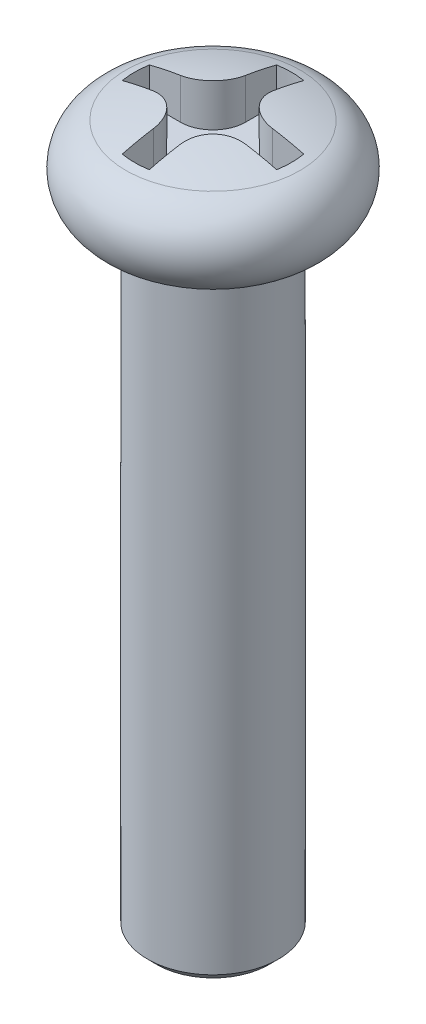
ISO-10303-21;
HEADER;
FILE_DESCRIPTION(('STEP AP214'),'2;1');
FILE_NAME('part.step','',(''),(''),'','','');
FILE_SCHEMA(('AUTOMOTIVE_DESIGN { 1 0 10303 214 1 1 1 1 }'));
ENDSEC;
DATA;
#1=APPLICATION_CONTEXT('core data for automotive mechanical design processes');
#2=APPLICATION_PROTOCOL_DEFINITION('international standard','automotive_design',2000,#1);
#3=PRODUCT_CONTEXT('',#1,'mechanical');
#4=PRODUCT('Part','Part','',(#3));
#5=PRODUCT_RELATED_PRODUCT_CATEGORY('part','',(#4));
#6=PRODUCT_DEFINITION_FORMATION('','',#4);
#7=PRODUCT_DEFINITION_CONTEXT('part definition',#1,'design');
#8=PRODUCT_DEFINITION('design','',#6,#7);
#9=PRODUCT_DEFINITION_SHAPE('','',#8);
#10=(LENGTH_UNIT() NAMED_UNIT(*) SI_UNIT(.MILLI.,.METRE.));
#11=(NAMED_UNIT(*) PLANE_ANGLE_UNIT() SI_UNIT($,.RADIAN.));
#12=(NAMED_UNIT(*) SI_UNIT($,.STERADIAN.) SOLID_ANGLE_UNIT());
#13=UNCERTAINTY_MEASURE_WITH_UNIT(LENGTH_MEASURE(1.E-05),#10,'distance_accuracy_value','');
#14=(GEOMETRIC_REPRESENTATION_CONTEXT(3) GLOBAL_UNCERTAINTY_ASSIGNED_CONTEXT((#13)) GLOBAL_UNIT_ASSIGNED_CONTEXT((#10,
#11,#12)) REPRESENTATION_CONTEXT('',''));
#15=CARTESIAN_POINT('',(0.,0.,0.));
#16=DIRECTION('',(0.,0.,1.));
#17=DIRECTION('',(1.,0.,0.));
#18=AXIS2_PLACEMENT_3D('',#15,#16,#17);
#19=CARTESIAN_POINT('',(0.8838834764832,0.85,-0.8838834764832));
#20=DIRECTION('',(0.,1.,0.));
#21=DIRECTION('',(1.,0.,0.));
#22=AXIS2_PLACEMENT_3D('',#19,#20,#21);
#23=CYLINDRICAL_SURFACE('',#22,0.625);
#24=DIRECTION('',(0.,1.,0.));
#25=VECTOR('',#24,1.);
#26=CARTESIAN_POINT('',(0.2588834764932,0.85000000001,-0.8838834764932));
#27=LINE('',#26,#25);
#28=CARTESIAN_POINT('',(0.2588834764832,0.85,-0.8838834764832));
#29=VERTEX_POINT('',#28);
#30=CARTESIAN_POINT('',(0.2588834764832,1.625758041496,-0.8838834764832));
#31=VERTEX_POINT('',#30);
#32=EDGE_CURVE('E39',#29,#31,#27,.T.);
#33=ORIENTED_EDGE('',*,*,#32,.F.);
#34=CARTESIAN_POINT('',(0.8838834764932,0.85000000001,-0.8838834764932));
#35=DIRECTION('',(0.,1.,0.));
#36=DIRECTION('',(-1.,0.,0.));
#37=AXIS2_PLACEMENT_3D('',#34,#35,#36);
#38=CIRCLE('',#37,0.625);
#39=CARTESIAN_POINT('',(0.8838834764832,0.85,-0.2588834764832));
#40=VERTEX_POINT('',#39);
#41=EDGE_CURVE('E11',#29,#40,#38,.T.);
#42=ORIENTED_EDGE('',*,*,#41,.T.);
#43=DIRECTION('',(0.,1.,0.));
#44=VECTOR('',#43,1.);
#45=CARTESIAN_POINT('',(0.8838834764932,0.85000000001,-0.2588834764932));
#46=LINE('',#45,#44);
#47=CARTESIAN_POINT('',(0.8838834764832,1.625758041496,-0.2588834764832));
#48=VERTEX_POINT('',#47);
#49=EDGE_CURVE('E28',#40,#48,#46,.T.);
#50=ORIENTED_EDGE('',*,*,#49,.T.);
#51=CARTESIAN_POINT('',(0.2588834764932,1.625758041506,-0.8838834764932));
#52=CARTESIAN_POINT('',(0.2588834764932,1.627313817163,-0.8738932386037));
#53=CARTESIAN_POINT('',(0.2593614768653,1.63034839356,-0.8539208494841));
#54=CARTESIAN_POINT('',(0.2615225676338,1.634673278244,-0.8239545492494));
#55=CARTESIAN_POINT('',(0.2650935390921,1.63872019528,-0.7943462278779));
#56=CARTESIAN_POINT('',(0.2700536841239,1.642515148454,-0.7649531756351));
#57=CARTESIAN_POINT('',(0.2767499563393,1.646228723206,-0.7343323588506));
#58=CARTESIAN_POINT('',(0.2857599781692,1.649942886485,-0.7013784870498));
#59=CARTESIAN_POINT('',(0.2980319218556,1.65369658224,-0.6648919217842));
#60=CARTESIAN_POINT('',(0.3145124725157,1.657361744586,-0.6247522681375));
#61=CARTESIAN_POINT('',(0.3364639007554,1.660768644949,-0.5807949332556));
#62=CARTESIAN_POINT('',(0.3650765799814,1.663614857499,-0.5337874817505));
#63=CARTESIAN_POINT('',(0.4006323004999,1.665513948944,-0.4859527733813));
#64=CARTESIAN_POINT('',(0.4430484395472,1.666174855786,-0.4392623764243));
#65=CARTESIAN_POINT('',(0.4925759173538,1.66536575229,-0.3949675528772));
#66=CARTESIAN_POINT('',(0.5489382072169,1.662886586189,-0.3546342400591));
#67=CARTESIAN_POINT('',(0.6115583802521,1.658585384304,-0.3198068479943));
#68=CARTESIAN_POINT('',(0.6775697978204,1.652591342923,-0.2924914538816));
#69=CARTESIAN_POINT('',(0.7456724189569,1.645052014393,-0.2730026794436));
#70=CARTESIAN_POINT('',(0.8147416661566,1.636123692416,-0.2614199025382));
#71=CARTESIAN_POINT('',(0.8609123051746,1.629335332612,-0.2588834764932));
#72=CARTESIAN_POINT('',(0.8838834764932,1.625758041506,-0.2588834764932));
#73=B_SPLINE_CURVE_WITH_KNOTS('',3,(#51,#52,#53,#54,#55,#56,#57,#58,#59,#60,#61,#62,#63,#64,#65,
#66,#67,#68,#69,#70,#71,#72),.UNSPECIFIED.,.F.,.F.,(4,1,1,1,1,1,1,1,1,1,1,1,1,1,1,1,1,1,1,4),
(0.,0.05263157894737,0.1052631578947,0.1578947368421,0.2105263157895,0.2631578947368,
0.3157894736842,0.3684210526316,0.4210526315789,0.4736842105263,0.5263157894737,0.5789473684211,
0.6315789473684,0.6842105263158,0.7368421052632,0.7894736842105,0.8421052631579,0.8947368421053,
0.9473684210526,1.),.UNSPECIFIED.);
#74=EDGE_CURVE('E195',#31,#48,#73,.T.);
#75=ORIENTED_EDGE('',*,*,#74,.F.);
#76=EDGE_LOOP('',(#33,#42,#50,#75));
#77=FACE_BOUND('',#76,.T.);
#78=ADVANCED_FACE('F17',(#77),#23,.T.);
#79=CARTESIAN_POINT('',(0.8838834764832,0.85,-0.2588834764832));
#80=DIRECTION('',(0.,0.,-1.));
#81=DIRECTION('',(0.,-1.,0.));
#82=AXIS2_PLACEMENT_3D('',#79,#80,#81);
#83=PLANE('',#82);
#84=ORIENTED_EDGE('',*,*,#49,.F.);
#85=DIRECTION('',(1.,0.,0.));
#86=VECTOR('',#85,1.);
#87=CARTESIAN_POINT('',(0.8838834764932,0.85000000001,-0.2588834764932));
#88=LINE('',#87,#86);
#89=CARTESIAN_POINT('',(1.477490895269,0.85,-0.2588834764832));
#90=VERTEX_POINT('',#89);
#91=EDGE_CURVE('E201',#40,#90,#88,.T.);
#92=ORIENTED_EDGE('',*,*,#91,.T.);
#93=DIRECTION('',(0.,1.,0.));
#94=VECTOR('',#93,1.);
#95=CARTESIAN_POINT('',(1.477490895279,0.85000000001,-0.2588834764932));
#96=LINE('',#95,#94);
#97=CARTESIAN_POINT('',(1.477490895269,1.500900827794,-0.2588834764832));
#98=VERTEX_POINT('',#97);
#99=EDGE_CURVE('E205',#90,#98,#96,.T.);
#100=ORIENTED_EDGE('',*,*,#99,.T.);
#101=CARTESIAN_POINT('',(0.,-4.05000000001,-0.2588834764932));
#102=DIRECTION('',(0.,0.,-1.));
#103=DIRECTION('',(0.153874903711735,0.988090336967073,0.));
#104=AXIS2_PLACEMENT_3D('',#101,#102,#103);
#105=CIRCLE('',#104,5.7441692);
#106=EDGE_CURVE('E285',#48,#98,#105,.T.);
#107=ORIENTED_EDGE('',*,*,#106,.F.);
#108=EDGE_LOOP('',(#84,#92,#100,#107));
#109=FACE_BOUND('',#108,.T.);
#110=ADVANCED_FACE('F463',(#109),#83,.F.);
#111=CARTESIAN_POINT('',(0.2588834764832,0.85,-1.477490895269));
#112=DIRECTION('',(1.,0.,0.));
#113=DIRECTION('',(0.,1.,0.));
#114=AXIS2_PLACEMENT_3D('',#111,#112,#113);
#115=PLANE('',#114);
#116=DIRECTION('',(0.,1.,0.));
#117=VECTOR('',#116,1.);
#118=CARTESIAN_POINT('',(0.2588834764932,0.85000000001,-1.477490895279));
#119=LINE('',#118,#117);
#120=CARTESIAN_POINT('',(0.2588834764832,0.85,-1.477490895269));
#121=VERTEX_POINT('',#120);
#122=CARTESIAN_POINT('',(0.2588834764832,1.500900827794,-1.477490895269));
#123=VERTEX_POINT('',#122);
#124=EDGE_CURVE('E179',#121,#123,#119,.T.);
#125=ORIENTED_EDGE('',*,*,#124,.F.);
#126=DIRECTION('',(0.,0.,1.));
#127=VECTOR('',#126,1.);
#128=CARTESIAN_POINT('',(0.2588834764932,0.85000000001,-1.477490895279));
#129=LINE('',#128,#127);
#130=EDGE_CURVE('E247',#121,#29,#129,.T.);
#131=ORIENTED_EDGE('',*,*,#130,.T.);
#132=ORIENTED_EDGE('',*,*,#32,.T.);
#133=CARTESIAN_POINT('',(0.2588834764932,-4.05000000001,0.));
#134=DIRECTION('',(1.,0.,0.));
#135=DIRECTION('',(0.,0.966353997000082,-0.257215770282393));
#136=AXIS2_PLACEMENT_3D('',#133,#134,#135);
#137=CIRCLE('',#136,5.7441692);
#138=EDGE_CURVE('E190',#123,#31,#137,.T.);
#139=ORIENTED_EDGE('',*,*,#138,.F.);
#140=EDGE_LOOP('',(#125,#131,#132,#139));
#141=FACE_BOUND('',#140,.T.);
#142=ADVANCED_FACE('F469',(#141),#115,.F.);
#143=CARTESIAN_POINT('',(0.,-12.,0.));
#144=DIRECTION('',(0.,-1.,0.));
#145=DIRECTION('',(0.,0.,-1.));
#146=AXIS2_PLACEMENT_3D('',#143,#144,#145);
#147=PLANE('',#146);
#148=CARTESIAN_POINT('',(0.,-12.00000000001,0.));
#149=DIRECTION('',(0.,1.,0.));
#150=DIRECTION('',(-1.,0.,0.));
#151=AXIS2_PLACEMENT_3D('',#148,#149,#150);
#152=CIRCLE('',#151,1.075);
#153=CARTESIAN_POINT('',(-1.075,-12.00000000001,0.));
#154=VERTEX_POINT('',#153);
#155=EDGE_CURVE('E243',#154,#154,#152,.T.);
#156=ORIENTED_EDGE('',*,*,#155,.F.);
#157=EDGE_LOOP('',(#156));
#158=FACE_BOUND('',#157,.T.);
#159=ADVANCED_FACE('F19',(#158),#147,.T.);
#160=CARTESIAN_POINT('',(0.,-11.9125,0.));
#161=DIRECTION('',(0.,1.,0.));
#162=DIRECTION('',(1.,0.,0.));
#163=AXIS2_PLACEMENT_3D('',#160,#161,#162);
#164=CONICAL_SURFACE('',#163,1.1625,0.7853981634);
#165=CARTESIAN_POINT('',(0.,-11.82500000001,0.));
#166=DIRECTION('',(0.,-1.,0.));
#167=DIRECTION('',(-1.,0.,0.));
#168=AXIS2_PLACEMENT_3D('',#165,#166,#167);
#169=CIRCLE('',#168,1.25);
#170=CARTESIAN_POINT('',(-1.25,-11.82500000001,0.));
#171=VERTEX_POINT('',#170);
#172=EDGE_CURVE('E277',#171,#171,#169,.T.);
#173=ORIENTED_EDGE('',*,*,#172,.T.);
#174=EDGE_LOOP('',(#173));
#175=FACE_BOUND('',#174,.T.);
#176=ORIENTED_EDGE('',*,*,#155,.T.);
#177=EDGE_LOOP('',(#176));
#178=FACE_BOUND('',#177,.T.);
#179=ADVANCED_FACE('F478',(#175,#178),#164,.T.);
#180=CARTESIAN_POINT('',(-0.2588834764832,0.85,-0.8838834764832));
#181=DIRECTION('',(-1.,0.,0.));
#182=DIRECTION('',(0.,0.,1.));
#183=AXIS2_PLACEMENT_3D('',#180,#181,#182);
#184=PLANE('',#183);
#185=DIRECTION('',(0.,1.,0.));
#186=VECTOR('',#185,1.);
#187=CARTESIAN_POINT('',(-0.2588834764932,0.85000000001,-0.8838834764932));
#188=LINE('',#187,#186);
#189=CARTESIAN_POINT('',(-0.2588834764832,0.85,-0.8838834764832));
#190=VERTEX_POINT('',#189);
#191=CARTESIAN_POINT('',(-0.2588834764832,1.625758041496,-0.8838834764832));
#192=VERTEX_POINT('',#191);
#193=EDGE_CURVE('E146',#190,#192,#188,.T.);
#194=ORIENTED_EDGE('',*,*,#193,.F.);
#195=DIRECTION('',(0.,0.,-1.));
#196=VECTOR('',#195,1.);
#197=CARTESIAN_POINT('',(-0.2588834764932,0.85000000001,-0.8838834764932));
#198=LINE('',#197,#196);
#199=CARTESIAN_POINT('',(-0.2588834764832,0.85,-1.477490895269));
#200=VERTEX_POINT('',#199);
#201=EDGE_CURVE('E239',#190,#200,#198,.T.);
#202=ORIENTED_EDGE('',*,*,#201,.T.);
#203=DIRECTION('',(0.,1.,0.));
#204=VECTOR('',#203,1.);
#205=CARTESIAN_POINT('',(-0.2588834764932,0.85000000001,-1.477490895279));
#206=LINE('',#205,#204);
#207=CARTESIAN_POINT('',(-0.2588834764832,1.500900827794,-1.477490895269));
#208=VERTEX_POINT('',#207);
#209=EDGE_CURVE('E210',#200,#208,#206,.T.);
#210=ORIENTED_EDGE('',*,*,#209,.T.);
#211=CARTESIAN_POINT('',(-0.2588834764932,-4.05000000001,0.));
#212=DIRECTION('',(-1.,0.,0.));
#213=DIRECTION('',(0.,0.988090336967073,-0.153874903711735));
#214=AXIS2_PLACEMENT_3D('',#211,#212,#213);
#215=CIRCLE('',#214,5.7441692);
#216=EDGE_CURVE('E196',#192,#208,#215,.T.);
#217=ORIENTED_EDGE('',*,*,#216,.F.);
#218=EDGE_LOOP('',(#194,#202,#210,#217));
#219=FACE_BOUND('',#218,.T.);
#220=ADVANCED_FACE('F375',(#219),#184,.F.);
#221=CARTESIAN_POINT('',(0.,0.,0.));
#222=DIRECTION('',(0.,-1.,0.));
#223=DIRECTION('',(0.,0.,-1.));
#224=AXIS2_PLACEMENT_3D('',#221,#222,#223);
#225=PLANE('',#224);
#226=CARTESIAN_POINT('',(0.,0.,0.));
#227=DIRECTION('',(0.,1.,0.));
#228=DIRECTION('',(1.,0.,0.));
#229=AXIS2_PLACEMENT_3D('',#226,#227,#228);
#230=CIRCLE('',#229,1.9080174);
#231=CARTESIAN_POINT('',(1.9080174,0.,0.));
#232=VERTEX_POINT('',#231);
#233=EDGE_CURVE('E304',#232,#232,#230,.T.);
#234=ORIENTED_EDGE('',*,*,#233,.F.);
#235=EDGE_LOOP('',(#234));
#236=FACE_BOUND('',#235,.T.);
#237=CARTESIAN_POINT('',(0.,0.,0.));
#238=DIRECTION('',(0.,-1.,0.));
#239=DIRECTION('',(1.,0.,0.));
#240=AXIS2_PLACEMENT_3D('',#237,#238,#239);
#241=CIRCLE('',#240,1.25);
#242=CARTESIAN_POINT('',(1.25,0.,0.));
#243=VERTEX_POINT('',#242);
#244=EDGE_CURVE('E206',#243,#243,#241,.T.);
#245=ORIENTED_EDGE('',*,*,#244,.F.);
#246=EDGE_LOOP('',(#245));
#247=FACE_BOUND('',#246,.T.);
#248=ADVANCED_FACE('F715',(#236,#247),#225,.T.);
#249=CARTESIAN_POINT('',(0.,2.385,0.));
#250=DIRECTION('',(0.,1.,0.));
#251=DIRECTION('',(-1.,0.,0.));
#252=AXIS2_PLACEMENT_3D('',#249,#250,#251);
#253=CYLINDRICAL_SURFACE('',#252,1.25);
#254=ORIENTED_EDGE('',*,*,#172,.F.);
#255=EDGE_LOOP('',(#254));
#256=FACE_BOUND('',#255,.T.);
#257=ORIENTED_EDGE('',*,*,#244,.T.);
#258=EDGE_LOOP('',(#257));
#259=FACE_BOUND('',#258,.T.);
#260=ADVANCED_FACE('F474',(#256,#259),#253,.T.);
#261=CARTESIAN_POINT('',(0.,0.85,0.));
#262=DIRECTION('',(0.,-1.,0.));
#263=DIRECTION('',(0.,0.,-1.));
#264=AXIS2_PLACEMENT_3D('',#261,#262,#263);
#265=PLANE('',#264);
#266=CARTESIAN_POINT('',(-0.8838834764932,0.85000000001,0.8838834764932));
#267=DIRECTION('',(0.,1.,0.));
#268=DIRECTION('',(1.,0.,0.));
#269=AXIS2_PLACEMENT_3D('',#266,#267,#268);
#270=CIRCLE('',#269,0.625);
#271=CARTESIAN_POINT('',(-0.2588834764832,0.85,0.8838834764832));
#272=VERTEX_POINT('',#271);
#273=CARTESIAN_POINT('',(-0.8838834764832,0.85,0.2588834764832));
#274=VERTEX_POINT('',#273);
#275=EDGE_CURVE('E184',#272,#274,#270,.T.);
#276=ORIENTED_EDGE('',*,*,#275,.F.);
#277=DIRECTION('',(0.,0.,-1.));
#278=VECTOR('',#277,1.);
#279=CARTESIAN_POINT('',(-0.2588834764932,0.85000000001,1.477490895279));
#280=LINE('',#279,#278);
#281=CARTESIAN_POINT('',(-0.2588834764832,0.85,1.477490895269));
#282=VERTEX_POINT('',#281);
#283=EDGE_CURVE('E185',#282,#272,#280,.T.);
#284=ORIENTED_EDGE('',*,*,#283,.F.);
#285=CARTESIAN_POINT('',(0.,0.85000000001,0.));
#286=DIRECTION('',(0.,-1.,0.));
#287=DIRECTION('',(0.172588984327435,0.,0.984993930178671));
#288=AXIS2_PLACEMENT_3D('',#285,#286,#287);
#289=CIRCLE('',#288,1.5);
#290=CARTESIAN_POINT('',(0.2588834764832,0.85,1.477490895269));
#291=VERTEX_POINT('',#290);
#292=EDGE_CURVE('E170',#291,#282,#289,.T.);
#293=ORIENTED_EDGE('',*,*,#292,.F.);
#294=DIRECTION('',(0.,0.,1.));
#295=VECTOR('',#294,1.);
#296=CARTESIAN_POINT('',(0.2588834764932,0.85000000001,0.8838834764932));
#297=LINE('',#296,#295);
#298=CARTESIAN_POINT('',(0.2588834764832,0.85,0.8838834764832));
#299=VERTEX_POINT('',#298);
#300=EDGE_CURVE('E227',#299,#291,#297,.T.);
#301=ORIENTED_EDGE('',*,*,#300,.F.);
#302=CARTESIAN_POINT('',(0.8838834764932,0.85000000001,0.8838834764932));
#303=DIRECTION('',(0.,1.,0.));
#304=DIRECTION('',(0.,0.,-1.));
#305=AXIS2_PLACEMENT_3D('',#302,#303,#304);
#306=CIRCLE('',#305,0.625);
#307=CARTESIAN_POINT('',(0.8838834764832,0.85,0.2588834764832));
#308=VERTEX_POINT('',#307);
#309=EDGE_CURVE('E224',#308,#299,#306,.T.);
#310=ORIENTED_EDGE('',*,*,#309,.F.);
#311=DIRECTION('',(-1.,0.,0.));
#312=VECTOR('',#311,1.);
#313=CARTESIAN_POINT('',(1.477490895279,0.85000000001,0.2588834764932));
#314=LINE('',#313,#312);
#315=CARTESIAN_POINT('',(1.477490895269,0.85,0.2588834764832));
#316=VERTEX_POINT('',#315);
#317=EDGE_CURVE('E220',#316,#308,#314,.T.);
#318=ORIENTED_EDGE('',*,*,#317,.F.);
#319=CARTESIAN_POINT('',(0.,0.85000000001,0.));
#320=DIRECTION('',(0.,-1.,0.));
#321=DIRECTION('',(0.984993930178671,0.,-0.172588984327435));
#322=AXIS2_PLACEMENT_3D('',#319,#320,#321);
#323=CIRCLE('',#322,1.5);
#324=EDGE_CURVE('E21',#90,#316,#323,.T.);
#325=ORIENTED_EDGE('',*,*,#324,.F.);
#326=ORIENTED_EDGE('',*,*,#91,.F.);
#327=ORIENTED_EDGE('',*,*,#41,.F.);
#328=ORIENTED_EDGE('',*,*,#130,.F.);
#329=CARTESIAN_POINT('',(0.,0.85000000001,0.));
#330=DIRECTION('',(0.,-1.,0.));
#331=DIRECTION('',(-0.172588984327435,0.,-0.984993930178671));
#332=AXIS2_PLACEMENT_3D('',#329,#330,#331);
#333=CIRCLE('',#332,1.5);
#334=EDGE_CURVE('E175',#200,#121,#333,.T.);
#335=ORIENTED_EDGE('',*,*,#334,.F.);
#336=ORIENTED_EDGE('',*,*,#201,.F.);
#337=CARTESIAN_POINT('',(-0.8838834764932,0.85000000001,-0.8838834764932));
#338=DIRECTION('',(0.,1.,0.));
#339=DIRECTION('',(0.,0.,1.));
#340=AXIS2_PLACEMENT_3D('',#337,#338,#339);
#341=CIRCLE('',#340,0.625);
#342=CARTESIAN_POINT('',(-0.8838834764832,0.85,-0.2588834764832));
#343=VERTEX_POINT('',#342);
#344=EDGE_CURVE('E141',#343,#190,#341,.T.);
#345=ORIENTED_EDGE('',*,*,#344,.F.);
#346=DIRECTION('',(1.,0.,0.));
#347=VECTOR('',#346,1.);
#348=CARTESIAN_POINT('',(-1.477490895279,0.85000000001,-0.2588834764932));
#349=LINE('',#348,#347);
#350=CARTESIAN_POINT('',(-1.477490895269,0.85,-0.2588834764832));
#351=VERTEX_POINT('',#350);
#352=EDGE_CURVE('E136',#351,#343,#349,.T.);
#353=ORIENTED_EDGE('',*,*,#352,.F.);
#354=CARTESIAN_POINT('',(0.,0.85000000001,0.));
#355=DIRECTION('',(0.,-1.,0.));
#356=DIRECTION('',(-0.984993930178671,0.,0.172588984327435));
#357=AXIS2_PLACEMENT_3D('',#354,#355,#356);
#358=CIRCLE('',#357,1.5);
#359=CARTESIAN_POINT('',(-1.477490895269,0.85,0.2588834764832));
#360=VERTEX_POINT('',#359);
#361=EDGE_CURVE('E121',#360,#351,#358,.T.);
#362=ORIENTED_EDGE('',*,*,#361,.F.);
#363=DIRECTION('',(-1.,0.,0.));
#364=VECTOR('',#363,1.);
#365=CARTESIAN_POINT('',(-0.8838834764932,0.85000000001,0.2588834764932));
#366=LINE('',#365,#364);
#367=EDGE_CURVE('E215',#274,#360,#366,.T.);
#368=ORIENTED_EDGE('',*,*,#367,.F.);
#369=EDGE_LOOP('',(#276,#284,#293,#301,#310,#318,#325,#326,#327,#328,#335,#336,#345,#353,#362,#368));
#370=FACE_BOUND('',#369,.T.);
#371=ADVANCED_FACE('F138',(#370),#265,.F.);
#372=CARTESIAN_POINT('',(-0.8838834764832,0.85,-0.8838834764832));
#373=DIRECTION('',(0.,1.,0.));
#374=DIRECTION('',(1.,0.,0.));
#375=AXIS2_PLACEMENT_3D('',#372,#373,#374);
#376=CYLINDRICAL_SURFACE('',#375,0.625);
#377=DIRECTION('',(0.,1.,0.));
#378=VECTOR('',#377,1.);
#379=CARTESIAN_POINT('',(-0.8838834764932,0.85000000001,-0.2588834764932));
#380=LINE('',#379,#378);
#381=CARTESIAN_POINT('',(-0.8838834764832,1.625758041496,-0.2588834764832));
#382=VERTEX_POINT('',#381);
#383=EDGE_CURVE('E147',#343,#382,#380,.T.);
#384=ORIENTED_EDGE('',*,*,#383,.F.);
#385=ORIENTED_EDGE('',*,*,#344,.T.);
#386=ORIENTED_EDGE('',*,*,#193,.T.);
#387=CARTESIAN_POINT('',(-0.8838834764932,1.625758041506,-0.2588834764932));
#388=CARTESIAN_POINT('',(-0.8597301232266,1.629519433323,-0.2588834764932));
#389=CARTESIAN_POINT('',(-0.8111778453423,1.636636006742,-0.2616893322205));
#390=CARTESIAN_POINT('',(-0.7386926581101,1.645905674309,-0.2744825457413));
#391=CARTESIAN_POINT('',(-0.6672558149884,1.653642988734,-0.2960201800266));
#392=CARTESIAN_POINT('',(-0.5979431944862,1.65967087889,-0.3264104482916));
#393=CARTESIAN_POINT('',(-0.5335866146737,1.663724976224,-0.364566126257));
#394=CARTESIAN_POINT('',(-0.4774020914024,1.665779073286,-0.407468423897));
#395=CARTESIAN_POINT('',(-0.4286335195869,1.666130665842,-0.4539631112705));
#396=CARTESIAN_POINT('',(-0.386908550875,1.664970386944,-0.5031915333363));
#397=CARTESIAN_POINT('',(-0.3536013360142,1.662638116699,-0.5515763557938));
#398=CARTESIAN_POINT('',(-0.3284129753695,1.65964993502,-0.5960731551955));
#399=CARTESIAN_POINT('',(-0.3093326553854,1.656315043544,-0.6366899794846));
#400=CARTESIAN_POINT('',(-0.2949538298627,1.652834733323,-0.6735307970108));
#401=CARTESIAN_POINT('',(-0.2840644608308,1.649304392169,-0.7071909974746));
#402=CARTESIAN_POINT('',(-0.2757672514097,1.645738077292,-0.7384767574349));
#403=CARTESIAN_POINT('',(-0.2694673555619,1.642119598844,-0.7680867978721));
#404=CARTESIAN_POINT('',(-0.2647385247077,1.638378053051,-0.7969031354469));
#405=CARTESIAN_POINT('',(-0.2613632460397,1.634414194251,-0.8257799594136));
#406=CARTESIAN_POINT('',(-0.2593329924808,1.630210917762,-0.8548326084619));
#407=CARTESIAN_POINT('',(-0.2588834764932,1.627265684631,-0.8742023162284));
#408=CARTESIAN_POINT('',(-0.2588834764932,1.625758041506,-0.8838834764932));
#409=B_SPLINE_CURVE_WITH_KNOTS('',3,(#387,#388,#389,#390,#391,#392,#393,#394,#395,#396,#397,
#398,#399,#400,#401,#402,#403,#404,#405,#406,#407,#408),.UNSPECIFIED.,.F.,.F.,(4,1,1,1,1,1,1,1,
1,1,1,1,1,1,1,1,1,1,1,4),(0.,0.05263157894737,0.1052631578947,0.1578947368421,0.2105263157895,
0.2631578947368,0.3157894736842,0.3684210526316,0.4210526315789,0.4736842105263,0.5263157894737,
0.5789473684211,0.6315789473684,0.6842105263158,0.7368421052632,0.7894736842105,0.8421052631579,
0.8947368421053,0.9473684210526,1.),.UNSPECIFIED.);
#410=EDGE_CURVE('E200',#382,#192,#409,.T.);
#411=ORIENTED_EDGE('',*,*,#410,.F.);
#412=EDGE_LOOP('',(#384,#385,#386,#411));
#413=FACE_BOUND('',#412,.T.);
#414=ADVANCED_FACE('F687',(#413),#376,.T.);
#415=CARTESIAN_POINT('',(-1.477490895269,0.85,-0.2588834764832));
#416=DIRECTION('',(0.,0.,-1.));
#417=DIRECTION('',(0.,-1.,0.));
#418=AXIS2_PLACEMENT_3D('',#415,#416,#417);
#419=PLANE('',#418);
#420=DIRECTION('',(0.,1.,0.));
#421=VECTOR('',#420,1.);
#422=CARTESIAN_POINT('',(-1.477490895279,0.85000000001,-0.2588834764932));
#423=LINE('',#422,#421);
#424=CARTESIAN_POINT('',(-1.477490895269,1.500900827794,-0.2588834764832));
#425=VERTEX_POINT('',#424);
#426=EDGE_CURVE('E125',#351,#425,#423,.T.);
#427=ORIENTED_EDGE('',*,*,#426,.F.);
#428=ORIENTED_EDGE('',*,*,#352,.T.);
#429=ORIENTED_EDGE('',*,*,#383,.T.);
#430=CARTESIAN_POINT('',(0.,-4.05000000001,-0.2588834764932));
#431=DIRECTION('',(0.,0.,-1.));
#432=DIRECTION('',(-0.257215770282393,0.966353997000082,0.));
#433=AXIS2_PLACEMENT_3D('',#430,#431,#432);
#434=CIRCLE('',#433,5.7441692);
#435=EDGE_CURVE('E151',#425,#382,#434,.T.);
#436=ORIENTED_EDGE('',*,*,#435,.F.);
#437=EDGE_LOOP('',(#427,#428,#429,#436));
#438=FACE_BOUND('',#437,.T.);
#439=ADVANCED_FACE('F149',(#438),#419,.F.);
#440=CARTESIAN_POINT('',(0.2588834764832,0.85,0.8838834764832));
#441=DIRECTION('',(1.,0.,0.));
#442=DIRECTION('',(0.,1.,0.));
#443=AXIS2_PLACEMENT_3D('',#440,#441,#442);
#444=PLANE('',#443);
#445=DIRECTION('',(0.,1.,0.));
#446=VECTOR('',#445,1.);
#447=CARTESIAN_POINT('',(0.2588834764932,0.85000000001,0.8838834764932));
#448=LINE('',#447,#446);
#449=CARTESIAN_POINT('',(0.2588834764832,1.625758041496,0.8838834764832));
#450=VERTEX_POINT('',#449);
#451=EDGE_CURVE('E133',#299,#450,#448,.T.);
#452=ORIENTED_EDGE('',*,*,#451,.F.);
#453=ORIENTED_EDGE('',*,*,#300,.T.);
#454=DIRECTION('',(0.,1.,0.));
#455=VECTOR('',#454,1.);
#456=CARTESIAN_POINT('',(0.2588834764932,0.85000000001,1.477490895279));
#457=LINE('',#456,#455);
#458=CARTESIAN_POINT('',(0.2588834764832,1.500900827794,1.477490895269));
#459=VERTEX_POINT('',#458);
#460=EDGE_CURVE('E250',#291,#459,#457,.T.);
#461=ORIENTED_EDGE('',*,*,#460,.T.);
#462=CARTESIAN_POINT('',(0.2588834764932,-4.05000000001,0.));
#463=DIRECTION('',(1.,0.,0.));
#464=DIRECTION('',(0.,0.988090336967073,0.153874903711735));
#465=AXIS2_PLACEMENT_3D('',#462,#463,#464);
#466=CIRCLE('',#465,5.7441692);
#467=EDGE_CURVE('E164',#450,#459,#466,.T.);
#468=ORIENTED_EDGE('',*,*,#467,.F.);
#469=EDGE_LOOP('',(#452,#453,#461,#468));
#470=FACE_BOUND('',#469,.T.);
#471=ADVANCED_FACE('F337',(#470),#444,.F.);
#472=CARTESIAN_POINT('',(-0.8838834764832,0.85,0.8838834764832));
#473=DIRECTION('',(0.,1.,0.));
#474=DIRECTION('',(1.,0.,0.));
#475=AXIS2_PLACEMENT_3D('',#472,#473,#474);
#476=CYLINDRICAL_SURFACE('',#475,0.625);
#477=DIRECTION('',(0.,1.,0.));
#478=VECTOR('',#477,1.);
#479=CARTESIAN_POINT('',(-0.2588834764932,0.85000000001,0.8838834764932));
#480=LINE('',#479,#478);
#481=CARTESIAN_POINT('',(-0.2588834764832,1.625758041496,0.8838834764832));
#482=VERTEX_POINT('',#481);
#483=EDGE_CURVE('E173',#272,#482,#480,.T.);
#484=ORIENTED_EDGE('',*,*,#483,.F.);
#485=ORIENTED_EDGE('',*,*,#275,.T.);
#486=DIRECTION('',(0.,1.,0.));
#487=VECTOR('',#486,1.);
#488=CARTESIAN_POINT('',(-0.8838834764932,0.85000000001,0.2588834764932));
#489=LINE('',#488,#487);
#490=CARTESIAN_POINT('',(-0.8838834764832,1.625758041496,0.2588834764832));
#491=VERTEX_POINT('',#490);
#492=EDGE_CURVE('E180',#274,#491,#489,.T.);
#493=ORIENTED_EDGE('',*,*,#492,.T.);
#494=CARTESIAN_POINT('',(-0.2588834764932,1.625758041506,0.8838834764932));
#495=CARTESIAN_POINT('',(-0.2588834764932,1.627313817163,0.8738932386037));
#496=CARTESIAN_POINT('',(-0.2593614768653,1.63034839356,0.8539208494841));
#497=CARTESIAN_POINT('',(-0.2615225676338,1.634673278244,0.8239545492494));
#498=CARTESIAN_POINT('',(-0.2650935390921,1.63872019528,0.7943462278779));
#499=CARTESIAN_POINT('',(-0.2700536841239,1.642515148454,0.7649531756351));
#500=CARTESIAN_POINT('',(-0.2767499563393,1.646228723206,0.7343323588506));
#501=CARTESIAN_POINT('',(-0.2857599781692,1.649942886485,0.7013784870498));
#502=CARTESIAN_POINT('',(-0.2980319218556,1.65369658224,0.6648919217842));
#503=CARTESIAN_POINT('',(-0.3145124725157,1.657361744586,0.6247522681375));
#504=CARTESIAN_POINT('',(-0.3364639007554,1.660768644949,0.5807949332556));
#505=CARTESIAN_POINT('',(-0.3650765799814,1.663614857499,0.5337874817505));
#506=CARTESIAN_POINT('',(-0.4006323004999,1.665513948944,0.4859527733813));
#507=CARTESIAN_POINT('',(-0.4430484395472,1.666174855786,0.4392623764243));
#508=CARTESIAN_POINT('',(-0.4925759173538,1.66536575229,0.3949675528772));
#509=CARTESIAN_POINT('',(-0.5489382072169,1.662886586189,0.3546342400591));
#510=CARTESIAN_POINT('',(-0.6115583802521,1.658585384304,0.3198068479943));
#511=CARTESIAN_POINT('',(-0.6775697978204,1.652591342923,0.2924914538816));
#512=CARTESIAN_POINT('',(-0.7456724189569,1.645052014393,0.2730026794436));
#513=CARTESIAN_POINT('',(-0.8147416661566,1.636123692416,0.2614199025382));
#514=CARTESIAN_POINT('',(-0.8609123051746,1.629335332612,0.2588834764932));
#515=CARTESIAN_POINT('',(-0.8838834764932,1.625758041506,0.2588834764932));
#516=B_SPLINE_CURVE_WITH_KNOTS('',3,(#494,#495,#496,#497,#498,#499,#500,#501,#502,#503,#504,
#505,#506,#507,#508,#509,#510,#511,#512,#513,#514,#515),.UNSPECIFIED.,.F.,.F.,(4,1,1,1,1,1,1,1,
1,1,1,1,1,1,1,1,1,1,1,4),(0.,0.05263157894737,0.1052631578947,0.1578947368421,0.2105263157895,
0.2631578947368,0.3157894736842,0.3684210526316,0.4210526315789,0.4736842105263,0.5263157894737,
0.5789473684211,0.6315789473684,0.6842105263158,0.7368421052632,0.7894736842105,0.8421052631579,
0.8947368421053,0.9473684210526,1.),.UNSPECIFIED.);
#517=EDGE_CURVE('E258',#482,#491,#516,.T.);
#518=ORIENTED_EDGE('',*,*,#517,.F.);
#519=EDGE_LOOP('',(#484,#485,#493,#518));
#520=FACE_BOUND('',#519,.T.);
#521=ADVANCED_FACE('F441',(#520),#476,.T.);
#522=CARTESIAN_POINT('',(-0.2588834764832,0.85,1.477490895269));
#523=DIRECTION('',(-1.,0.,0.));
#524=DIRECTION('',(0.,0.,1.));
#525=AXIS2_PLACEMENT_3D('',#522,#523,#524);
#526=PLANE('',#525);
#527=DIRECTION('',(0.,1.,0.));
#528=VECTOR('',#527,1.);
#529=CARTESIAN_POINT('',(-0.2588834764932,0.85000000001,1.477490895279));
#530=LINE('',#529,#528);
#531=CARTESIAN_POINT('',(-0.2588834764832,1.500900827794,1.477490895269));
#532=VERTEX_POINT('',#531);
#533=EDGE_CURVE('E174',#282,#532,#530,.T.);
#534=ORIENTED_EDGE('',*,*,#533,.F.);
#535=ORIENTED_EDGE('',*,*,#283,.T.);
#536=ORIENTED_EDGE('',*,*,#483,.T.);
#537=CARTESIAN_POINT('',(-0.2588834764932,-4.05000000001,0.));
#538=DIRECTION('',(-1.,0.,0.));
#539=DIRECTION('',(0.,0.966353997000082,0.257215770282393));
#540=AXIS2_PLACEMENT_3D('',#537,#538,#539);
#541=CIRCLE('',#540,5.7441692);
#542=EDGE_CURVE('E264',#532,#482,#541,.T.);
#543=ORIENTED_EDGE('',*,*,#542,.F.);
#544=EDGE_LOOP('',(#534,#535,#536,#543));
#545=FACE_BOUND('',#544,.T.);
#546=ADVANCED_FACE('F445',(#545),#526,.F.);
#547=CARTESIAN_POINT('',(0.,0.85,0.));
#548=DIRECTION('',(0.,1.,0.));
#549=DIRECTION('',(1.,0.,0.));
#550=AXIS2_PLACEMENT_3D('',#547,#548,#549);
#551=CYLINDRICAL_SURFACE('',#550,1.5);
#552=ORIENTED_EDGE('',*,*,#460,.F.);
#553=ORIENTED_EDGE('',*,*,#292,.T.);
#554=ORIENTED_EDGE('',*,*,#533,.T.);
#555=CARTESIAN_POINT('',(0.,1.500900827804,0.));
#556=DIRECTION('',(0.,-1.,0.));
#557=DIRECTION('',(0.172588984327435,0.,0.984993930178671));
#558=AXIS2_PLACEMENT_3D('',#555,#556,#557);
#559=CIRCLE('',#558,1.5);
#560=EDGE_CURVE('E169',#459,#532,#559,.T.);
#561=ORIENTED_EDGE('',*,*,#560,.F.);
#562=EDGE_LOOP('',(#552,#553,#554,#561));
#563=FACE_BOUND('',#562,.T.);
#564=ADVANCED_FACE('F483',(#563),#551,.F.);
#565=CARTESIAN_POINT('',(0.,0.6669905660283,0.));
#566=DIRECTION('',(0.,-1.,0.));
#567=DIRECTION('',(-1.,0.,0.));
#568=AXIS2_PLACEMENT_3D('',#565,#566,#567);
#569=TOROIDAL_SURFACE('',#568,1.4285714,0.8214286);
#570=ORIENTED_EDGE('',*,*,#233,.T.);
#571=EDGE_LOOP('',(#570));
#572=FACE_BOUND('',#571,.T.);
#573=CARTESIAN_POINT('',(0.,1.453155660376,0.));
#574=DIRECTION('',(0.,-1.,0.));
#575=DIRECTION('',(1.,0.,0.));
#576=AXIS2_PLACEMENT_3D('',#573,#574,#575);
#577=CIRCLE('',#576,1.6666667);
#578=CARTESIAN_POINT('',(1.6666667,1.453155660376,0.));
#579=VERTEX_POINT('',#578);
#580=EDGE_CURVE('E232',#579,#579,#577,.T.);
#581=ORIENTED_EDGE('',*,*,#580,.T.);
#582=EDGE_LOOP('',(#581));
#583=FACE_BOUND('',#582,.T.);
#584=ADVANCED_FACE('F458',(#572,#583),#569,.T.);
#585=CARTESIAN_POINT('',(0.,-4.05,0.));
#586=DIRECTION('',(0.,-1.,0.));
#587=DIRECTION('',(-1.,0.,0.));
#588=AXIS2_PLACEMENT_3D('',#585,#586,#587);
#589=SPHERICAL_SURFACE('',#588,5.75);
#590=ORIENTED_EDGE('',*,*,#580,.F.);
#591=EDGE_LOOP('',(#590));
#592=FACE_BOUND('',#591,.T.);
#593=CARTESIAN_POINT('',(0.,1.500900827804,0.));
#594=DIRECTION('',(0.,-1.,0.));
#595=DIRECTION('',(0.984993930178671,0.,-0.172588984327435));
#596=AXIS2_PLACEMENT_3D('',#593,#594,#595);
#597=CIRCLE('',#596,1.5);
#598=CARTESIAN_POINT('',(1.477490895269,1.500900827794,0.2588834764832));
#599=VERTEX_POINT('',#598);
#600=EDGE_CURVE('E228',#98,#599,#597,.T.);
#601=ORIENTED_EDGE('',*,*,#600,.T.);
#602=CARTESIAN_POINT('',(0.,-4.05000000001,0.2588834764932));
#603=DIRECTION('',(0.,0.,1.));
#604=DIRECTION('',(0.257215770282393,0.966353997000082,0.));
#605=AXIS2_PLACEMENT_3D('',#602,#603,#604);
#606=CIRCLE('',#605,5.7441692);
#607=CARTESIAN_POINT('',(0.8838834764832,1.625758041496,0.2588834764832));
#608=VERTEX_POINT('',#607);
#609=EDGE_CURVE('E159',#599,#608,#606,.T.);
#610=ORIENTED_EDGE('',*,*,#609,.T.);
#611=CARTESIAN_POINT('',(0.8838834764932,1.625758041506,0.2588834764932));
#612=CARTESIAN_POINT('',(0.8597301232267,1.629519433323,0.2588834764932));
#613=CARTESIAN_POINT('',(0.8111778453423,1.636636006742,0.2616893322205));
#614=CARTESIAN_POINT('',(0.7386926581101,1.645905674309,0.2744825457413));
#615=CARTESIAN_POINT('',(0.6672558149884,1.653642988734,0.2960201800266));
#616=CARTESIAN_POINT('',(0.5979431944862,1.65967087889,0.3264104482916));
#617=CARTESIAN_POINT('',(0.5335866146737,1.663724976224,0.364566126257));
#618=CARTESIAN_POINT('',(0.4774020914024,1.665779073286,0.407468423897));
#619=CARTESIAN_POINT('',(0.4286335195869,1.666130665842,0.4539631112704));
#620=CARTESIAN_POINT('',(0.386908550875,1.664970386944,0.5031915333363));
#621=CARTESIAN_POINT('',(0.3536013360142,1.662638116699,0.5515763557938));
#622=CARTESIAN_POINT('',(0.3284129753695,1.65964993502,0.5960731551955));
#623=CARTESIAN_POINT('',(0.3093326553854,1.656315043544,0.6366899794846));
#624=CARTESIAN_POINT('',(0.2949538298627,1.652834733323,0.6735307970108));
#625=CARTESIAN_POINT('',(0.2840644608308,1.649304392169,0.7071909974746));
#626=CARTESIAN_POINT('',(0.2757672514097,1.645738077292,0.7384767574349));
#627=CARTESIAN_POINT('',(0.2694673555619,1.642119598844,0.7680867978721));
#628=CARTESIAN_POINT('',(0.2647385247077,1.638378053051,0.7969031354469));
#629=CARTESIAN_POINT('',(0.2613632460397,1.634414194251,0.8257799594135));
#630=CARTESIAN_POINT('',(0.2593329924808,1.630210917762,0.8548326084619));
#631=CARTESIAN_POINT('',(0.2588834764932,1.627265684631,0.8742023162284));
#632=CARTESIAN_POINT('',(0.2588834764932,1.625758041506,0.8838834764932));
#633=B_SPLINE_CURVE_WITH_KNOTS('',3,(#611,#612,#613,#614,#615,#616,#617,#618,#619,#620,#621,
#622,#623,#624,#625,#626,#627,#628,#629,#630,#631,#632),.UNSPECIFIED.,.F.,.F.,(4,1,1,1,1,1,1,1,
1,1,1,1,1,1,1,1,1,1,1,4),(0.,0.05263157894737,0.1052631578947,0.1578947368421,0.2105263157895,
0.2631578947368,0.3157894736842,0.3684210526316,0.4210526315789,0.4736842105263,0.5263157894737,
0.5789473684211,0.6315789473684,0.6842105263158,0.7368421052632,0.7894736842105,0.8421052631579,
0.8947368421053,0.9473684210526,1.),.UNSPECIFIED.);
#634=EDGE_CURVE('E168',#608,#450,#633,.T.);
#635=ORIENTED_EDGE('',*,*,#634,.T.);
#636=ORIENTED_EDGE('',*,*,#467,.T.);
#637=ORIENTED_EDGE('',*,*,#560,.T.);
#638=ORIENTED_EDGE('',*,*,#542,.T.);
#639=ORIENTED_EDGE('',*,*,#517,.T.);
#640=CARTESIAN_POINT('',(0.,-4.05000000001,0.2588834764932));
#641=DIRECTION('',(0.,0.,1.));
#642=DIRECTION('',(-0.153874903711735,0.988090336967073,0.));
#643=AXIS2_PLACEMENT_3D('',#640,#641,#642);
#644=CIRCLE('',#643,5.7441692);
#645=CARTESIAN_POINT('',(-1.477490895269,1.500900827794,0.2588834764832));
#646=VERTEX_POINT('',#645);
#647=EDGE_CURVE('E189',#491,#646,#644,.T.);
#648=ORIENTED_EDGE('',*,*,#647,.T.);
#649=CARTESIAN_POINT('',(0.,1.500900827804,0.));
#650=DIRECTION('',(0.,-1.,0.));
#651=DIRECTION('',(-1.,0.,0.));
#652=AXIS2_PLACEMENT_3D('',#649,#650,#651);
#653=CIRCLE('',#652,1.5);
#654=EDGE_CURVE('E186',#646,#425,#653,.T.);
#655=ORIENTED_EDGE('',*,*,#654,.T.);
#656=ORIENTED_EDGE('',*,*,#435,.T.);
#657=ORIENTED_EDGE('',*,*,#410,.T.);
#658=ORIENTED_EDGE('',*,*,#216,.T.);
#659=CARTESIAN_POINT('',(0.,1.500900827804,0.));
#660=DIRECTION('',(0.,-1.,0.));
#661=DIRECTION('',(-0.172588984327435,0.,-0.984993930178671));
#662=AXIS2_PLACEMENT_3D('',#659,#660,#661);
#663=CIRCLE('',#662,1.5);
#664=EDGE_CURVE('E194',#208,#123,#663,.T.);
#665=ORIENTED_EDGE('',*,*,#664,.T.);
#666=ORIENTED_EDGE('',*,*,#138,.T.);
#667=ORIENTED_EDGE('',*,*,#74,.T.);
#668=ORIENTED_EDGE('',*,*,#106,.T.);
#669=EDGE_LOOP('',(#601,#610,#635,#636,#637,#638,#639,#648,#655,#656,#657,#658,#665,#666,#667,#668));
#670=FACE_BOUND('',#669,.T.);
#671=ADVANCED_FACE('F344',(#592,#670),#589,.T.);
#672=CARTESIAN_POINT('',(-0.8838834764832,0.85,0.2588834764832));
#673=DIRECTION('',(0.,0.,1.));
#674=DIRECTION('',(1.,0.,0.));
#675=AXIS2_PLACEMENT_3D('',#672,#673,#674);
#676=PLANE('',#675);
#677=ORIENTED_EDGE('',*,*,#492,.F.);
#678=ORIENTED_EDGE('',*,*,#367,.T.);
#679=DIRECTION('',(0.,1.,0.));
#680=VECTOR('',#679,1.);
#681=CARTESIAN_POINT('',(-1.477490895279,0.85000000001,0.2588834764932));
#682=LINE('',#681,#680);
#683=EDGE_CURVE('E128',#360,#646,#682,.T.);
#684=ORIENTED_EDGE('',*,*,#683,.T.);
#685=ORIENTED_EDGE('',*,*,#647,.F.);
#686=EDGE_LOOP('',(#677,#678,#684,#685));
#687=FACE_BOUND('',#686,.T.);
#688=ADVANCED_FACE('F448',(#687),#676,.F.);
#689=ORIENTED_EDGE('',*,*,#209,.F.);
#690=ORIENTED_EDGE('',*,*,#334,.T.);
#691=ORIENTED_EDGE('',*,*,#124,.T.);
#692=ORIENTED_EDGE('',*,*,#664,.F.);
#693=EDGE_LOOP('',(#689,#690,#691,#692));
#694=FACE_BOUND('',#693,.T.);
#695=ADVANCED_FACE('F380',(#694),#551,.F.);
#696=ORIENTED_EDGE('',*,*,#600,.F.);
#697=ORIENTED_EDGE('',*,*,#99,.F.);
#698=ORIENTED_EDGE('',*,*,#324,.T.);
#699=DIRECTION('',(0.,1.,0.));
#700=VECTOR('',#699,1.);
#701=CARTESIAN_POINT('',(1.477490895279,0.85000000001,0.2588834764932));
#702=LINE('',#701,#700);
#703=EDGE_CURVE('E216',#316,#599,#702,.T.);
#704=ORIENTED_EDGE('',*,*,#703,.T.);
#705=EDGE_LOOP('',(#696,#697,#698,#704));
#706=FACE_BOUND('',#705,.T.);
#707=ADVANCED_FACE('F411',(#706),#551,.F.);
#708=CARTESIAN_POINT('',(1.477490895269,0.85,0.2588834764832));
#709=DIRECTION('',(0.,0.,1.));
#710=DIRECTION('',(1.,0.,0.));
#711=AXIS2_PLACEMENT_3D('',#708,#709,#710);
#712=PLANE('',#711);
#713=ORIENTED_EDGE('',*,*,#703,.F.);
#714=ORIENTED_EDGE('',*,*,#317,.T.);
#715=DIRECTION('',(0.,1.,0.));
#716=VECTOR('',#715,1.);
#717=CARTESIAN_POINT('',(0.8838834764932,0.85000000001,0.2588834764932));
#718=LINE('',#717,#716);
#719=EDGE_CURVE('E233',#308,#608,#718,.T.);
#720=ORIENTED_EDGE('',*,*,#719,.T.);
#721=ORIENTED_EDGE('',*,*,#609,.F.);
#722=EDGE_LOOP('',(#713,#714,#720,#721));
#723=FACE_BOUND('',#722,.T.);
#724=ADVANCED_FACE('F414',(#723),#712,.F.);
#725=CARTESIAN_POINT('',(0.8838834764832,0.85,0.8838834764832));
#726=DIRECTION('',(0.,1.,0.));
#727=DIRECTION('',(1.,0.,0.));
#728=AXIS2_PLACEMENT_3D('',#725,#726,#727);
#729=CYLINDRICAL_SURFACE('',#728,0.625);
#730=ORIENTED_EDGE('',*,*,#719,.F.);
#731=ORIENTED_EDGE('',*,*,#309,.T.);
#732=ORIENTED_EDGE('',*,*,#451,.T.);
#733=ORIENTED_EDGE('',*,*,#634,.F.);
#734=EDGE_LOOP('',(#730,#731,#732,#733));
#735=FACE_BOUND('',#734,.T.);
#736=ADVANCED_FACE('F326',(#735),#729,.T.);
#737=ORIENTED_EDGE('',*,*,#683,.F.);
#738=ORIENTED_EDGE('',*,*,#361,.T.);
#739=ORIENTED_EDGE('',*,*,#426,.T.);
#740=ORIENTED_EDGE('',*,*,#654,.F.);
#741=EDGE_LOOP('',(#737,#738,#739,#740));
#742=FACE_BOUND('',#741,.T.);
#743=ADVANCED_FACE('F123',(#742),#551,.F.);
#744=CLOSED_SHELL('',(#78,#110,#142,#159,#179,#220,#248,#260,#371,#414,#439,#471,#521,#546,#564,
#584,#671,#688,#695,#707,#724,#736,#743));
#745=MANIFOLD_SOLID_BREP('B1',#744);
#746=ADVANCED_BREP_SHAPE_REPRESENTATION('',(#18,#745),#14);
#747=SHAPE_DEFINITION_REPRESENTATION(#9,#746);
ENDSEC;
END-ISO-10303-21;
